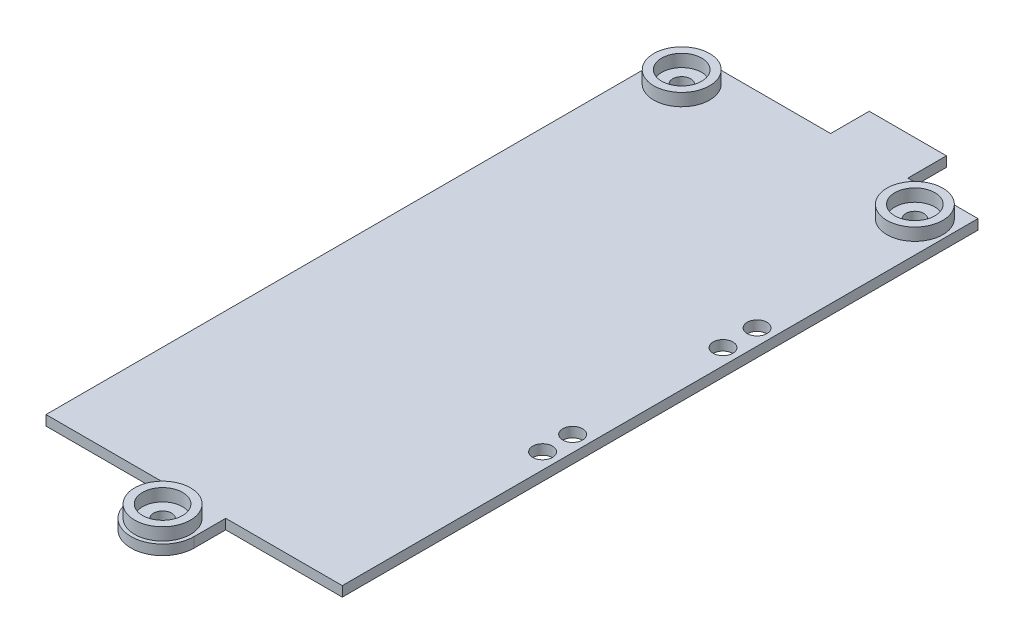
ISO-10303-21;
HEADER;
FILE_DESCRIPTION(('STEP AP214'),'2;1');
FILE_NAME('part.step','',(''),(''),'','','');
FILE_SCHEMA(('AUTOMOTIVE_DESIGN { 1 0 10303 214 1 1 1 1 }'));
ENDSEC;
DATA;
#1=APPLICATION_CONTEXT('core data for automotive mechanical design processes');
#2=APPLICATION_PROTOCOL_DEFINITION('international standard','automotive_design',2000,#1);
#3=PRODUCT_CONTEXT('',#1,'mechanical');
#4=PRODUCT('Part','Part','',(#3));
#5=PRODUCT_RELATED_PRODUCT_CATEGORY('part','',(#4));
#6=PRODUCT_DEFINITION_FORMATION('','',#4);
#7=PRODUCT_DEFINITION_CONTEXT('part definition',#1,'design');
#8=PRODUCT_DEFINITION('design','',#6,#7);
#9=PRODUCT_DEFINITION_SHAPE('','',#8);
#10=(LENGTH_UNIT() NAMED_UNIT(*) SI_UNIT(.MILLI.,.METRE.));
#11=(NAMED_UNIT(*) PLANE_ANGLE_UNIT() SI_UNIT($,.RADIAN.));
#12=(NAMED_UNIT(*) SI_UNIT($,.STERADIAN.) SOLID_ANGLE_UNIT());
#13=UNCERTAINTY_MEASURE_WITH_UNIT(LENGTH_MEASURE(1.E-05),#10,'distance_accuracy_value','');
#14=(GEOMETRIC_REPRESENTATION_CONTEXT(3) GLOBAL_UNCERTAINTY_ASSIGNED_CONTEXT((#13)) GLOBAL_UNIT_ASSIGNED_CONTEXT((#10,
#11,#12)) REPRESENTATION_CONTEXT('',''));
#15=CARTESIAN_POINT('',(0.,0.,0.));
#16=DIRECTION('',(0.,0.,1.));
#17=DIRECTION('',(1.,0.,0.));
#18=AXIS2_PLACEMENT_3D('',#15,#16,#17);
#19=CARTESIAN_POINT('',(0.,4.35801498127341,0.));
#20=DIRECTION('',(0.,1.,0.));
#21=DIRECTION('',(0.,0.,1.));
#22=AXIS2_PLACEMENT_3D('',#19,#20,#21);
#23=PLANE('',#22);
#24=CARTESIAN_POINT('',(2.05464419475655,4.35801498127341,2.23));
#25=DIRECTION('',(0.,1.,0.));
#26=DIRECTION('',(0.,0.,1.));
#27=AXIS2_PLACEMENT_3D('',#24,#25,#26);
#28=CIRCLE('',#27,1.143);
#29=CARTESIAN_POINT('',(2.05464419475655,4.35801498127341,3.373));
#30=VERTEX_POINT('',#29);
#31=EDGE_CURVE('E320',#30,#30,#28,.T.);
#32=ORIENTED_EDGE('',*,*,#31,.F.);
#33=EDGE_LOOP('',(#32));
#34=FACE_BOUND('',#33,.T.);
#35=CARTESIAN_POINT('',(2.05464419475655,4.35801498127341,2.23));
#36=DIRECTION('',(0.,1.,0.));
#37=DIRECTION('',(0.,0.,1.));
#38=AXIS2_PLACEMENT_3D('',#35,#36,#37);
#39=CIRCLE('',#38,2.54);
#40=CARTESIAN_POINT('',(2.05464419475655,4.35801498127341,4.77));
#41=VERTEX_POINT('',#40);
#42=EDGE_CURVE('E11',#41,#41,#39,.F.);
#43=ORIENTED_EDGE('',*,*,#42,.F.);
#44=EDGE_LOOP('',(#43));
#45=FACE_BOUND('',#44,.T.);
#46=ADVANCED_FACE('F37',(#34,#45),#23,.T.);
#47=CARTESIAN_POINT('',(-27.4853558052435,4.35801498127341,2.23));
#48=DIRECTION('',(0.,1.,0.));
#49=DIRECTION('',(0.,0.,1.));
#50=AXIS2_PLACEMENT_3D('',#47,#48,#49);
#51=CIRCLE('',#50,1.143);
#52=CARTESIAN_POINT('',(-27.4853558052435,4.35801498127341,3.373));
#53=VERTEX_POINT('',#52);
#54=EDGE_CURVE('E316',#53,#53,#51,.T.);
#55=ORIENTED_EDGE('',*,*,#54,.F.);
#56=EDGE_LOOP('',(#55));
#57=FACE_BOUND('',#56,.T.);
#58=CARTESIAN_POINT('',(-27.4853558052435,4.35801498127341,2.23));
#59=DIRECTION('',(0.,1.,0.));
#60=DIRECTION('',(0.,0.,1.));
#61=AXIS2_PLACEMENT_3D('',#58,#59,#60);
#62=CIRCLE('',#61,2.54);
#63=CARTESIAN_POINT('',(-27.4853558052435,4.35801498127341,4.77));
#64=VERTEX_POINT('',#63);
#65=EDGE_CURVE('E45',#64,#64,#62,.F.);
#66=ORIENTED_EDGE('',*,*,#65,.F.);
#67=EDGE_LOOP('',(#66));
#68=FACE_BOUND('',#67,.T.);
#69=ADVANCED_FACE('F184',(#57,#68),#23,.T.);
#70=CARTESIAN_POINT('',(-12.7153558052435,4.35801498127341,82.77));
#71=DIRECTION('',(0.,1.,0.));
#72=DIRECTION('',(0.,0.,1.));
#73=AXIS2_PLACEMENT_3D('',#70,#71,#72);
#74=CIRCLE('',#73,1.143);
#75=CARTESIAN_POINT('',(-12.7153558052435,4.35801498127341,83.913));
#76=VERTEX_POINT('',#75);
#77=EDGE_CURVE('E317',#76,#76,#74,.T.);
#78=ORIENTED_EDGE('',*,*,#77,.F.);
#79=EDGE_LOOP('',(#78));
#80=FACE_BOUND('',#79,.T.);
#81=CARTESIAN_POINT('',(-12.7153558052435,4.35801498127341,82.77));
#82=DIRECTION('',(0.,1.,0.));
#83=DIRECTION('',(0.,0.,1.));
#84=AXIS2_PLACEMENT_3D('',#81,#82,#83);
#85=CIRCLE('',#84,2.54);
#86=CARTESIAN_POINT('',(-12.7153558052435,4.35801498127341,85.31));
#87=VERTEX_POINT('',#86);
#88=EDGE_CURVE('E177',#87,#87,#85,.F.);
#89=ORIENTED_EDGE('',*,*,#88,.F.);
#90=EDGE_LOOP('',(#89));
#91=FACE_BOUND('',#90,.T.);
#92=ADVANCED_FACE('F186',(#80,#91),#23,.T.);
#93=CARTESIAN_POINT('',(0.,0.,-1.77));
#94=DIRECTION('',(0.,0.,-1.));
#95=DIRECTION('',(-1.,0.,0.));
#96=AXIS2_PLACEMENT_3D('',#93,#94,#95);
#97=PLANE('',#96);
#98=DIRECTION('',(1.,0.,0.));
#99=VECTOR('',#98,1.);
#100=CARTESIAN_POINT('',(0.,3.08801498127341,-1.77));
#101=LINE('',#100,#99);
#102=CARTESIAN_POINT('',(-31.4853558052435,3.08801498127341,-1.76999999999999));
#103=VERTEX_POINT('',#102);
#104=CARTESIAN_POINT('',(-12.6153558052435,3.08801498127341,-1.77));
#105=VERTEX_POINT('',#104);
#106=EDGE_CURVE('E139',#103,#105,#101,.T.);
#107=ORIENTED_EDGE('',*,*,#106,.F.);
#108=DIRECTION('',(0.,1.,0.));
#109=VECTOR('',#108,1.);
#110=CARTESIAN_POINT('',(-31.4853558052435,3.08801498127341,-1.77));
#111=LINE('',#110,#109);
#112=CARTESIAN_POINT('',(-31.4853558052435,4.35801498127341,-1.77));
#113=VERTEX_POINT('',#112);
#114=EDGE_CURVE('E167',#103,#113,#111,.T.);
#115=ORIENTED_EDGE('',*,*,#114,.T.);
#116=DIRECTION('',(1.,0.,0.));
#117=VECTOR('',#116,1.);
#118=CARTESIAN_POINT('',(0.,4.35801498127341,-1.77));
#119=LINE('',#118,#117);
#120=CARTESIAN_POINT('',(-12.6153558052435,4.35801498127341,-1.77));
#121=VERTEX_POINT('',#120);
#122=EDGE_CURVE('E278',#113,#121,#119,.T.);
#123=ORIENTED_EDGE('',*,*,#122,.T.);
#124=DIRECTION('',(0.,1.,0.));
#125=VECTOR('',#124,1.);
#126=CARTESIAN_POINT('',(-12.6153558052435,0.,-1.77));
#127=LINE('',#126,#125);
#128=EDGE_CURVE('E175',#105,#121,#127,.T.);
#129=ORIENTED_EDGE('',*,*,#128,.F.);
#130=EDGE_LOOP('',(#107,#115,#123,#129));
#131=FACE_BOUND('',#130,.T.);
#132=ADVANCED_FACE('F193',(#131),#97,.T.);
#133=CARTESIAN_POINT('',(0.,0.,78.77));
#134=DIRECTION('',(0.,0.,1.));
#135=DIRECTION('',(1.,0.,0.));
#136=AXIS2_PLACEMENT_3D('',#133,#134,#135);
#137=PLANE('',#136);
#138=DIRECTION('',(-1.,0.,0.));
#139=VECTOR('',#138,1.);
#140=CARTESIAN_POINT('',(0.,3.08801498127341,78.77));
#141=LINE('',#140,#139);
#142=CARTESIAN_POINT('',(6.05464419475655,3.08801498127341,78.77));
#143=VERTEX_POINT('',#142);
#144=CARTESIAN_POINT('',(-8.71535580524345,3.08801498127341,78.77));
#145=VERTEX_POINT('',#144);
#146=EDGE_CURVE('E251',#143,#145,#141,.T.);
#147=ORIENTED_EDGE('',*,*,#146,.F.);
#148=DIRECTION('',(0.,1.,0.));
#149=VECTOR('',#148,1.);
#150=CARTESIAN_POINT('',(6.05464419475655,3.08801498127341,78.77));
#151=LINE('',#150,#149);
#152=CARTESIAN_POINT('',(6.05464419475655,4.35801498127341,78.77));
#153=VERTEX_POINT('',#152);
#154=EDGE_CURVE('E172',#143,#153,#151,.T.);
#155=ORIENTED_EDGE('',*,*,#154,.T.);
#156=DIRECTION('',(1.,0.,0.));
#157=VECTOR('',#156,1.);
#158=CARTESIAN_POINT('',(0.,4.35801498127341,78.77));
#159=LINE('',#158,#157);
#160=CARTESIAN_POINT('',(-8.71535580524345,4.35801498127341,78.77));
#161=VERTEX_POINT('',#160);
#162=EDGE_CURVE('E250',#161,#153,#159,.T.);
#163=ORIENTED_EDGE('',*,*,#162,.F.);
#164=DIRECTION('',(0.,-1.,0.));
#165=VECTOR('',#164,1.);
#166=CARTESIAN_POINT('',(-8.71535580524345,14.4017234802582,78.77));
#167=LINE('',#166,#165);
#168=EDGE_CURVE('E52',#161,#145,#167,.T.);
#169=ORIENTED_EDGE('',*,*,#168,.T.);
#170=EDGE_LOOP('',(#147,#155,#163,#169));
#171=FACE_BOUND('',#170,.T.);
#172=ADVANCED_FACE('F229',(#171),#137,.T.);
#173=DIRECTION('',(1.,0.,0.));
#174=VECTOR('',#173,1.);
#175=CARTESIAN_POINT('',(0.,3.08801498127341,-1.77));
#176=LINE('',#175,#174);
#177=CARTESIAN_POINT('',(-2.83535580524345,3.08801498127341,-1.77));
#178=VERTEX_POINT('',#177);
#179=CARTESIAN_POINT('',(6.05464419475655,3.08801498127341,-1.77));
#180=VERTEX_POINT('',#179);
#181=EDGE_CURVE('E149',#178,#180,#176,.T.);
#182=ORIENTED_EDGE('',*,*,#181,.F.);
#183=DIRECTION('',(0.,-1.,0.));
#184=VECTOR('',#183,1.);
#185=CARTESIAN_POINT('',(-2.83535580524345,0.,-1.77));
#186=LINE('',#185,#184);
#187=CARTESIAN_POINT('',(-2.83535580524345,4.35801498127341,-1.77));
#188=VERTEX_POINT('',#187);
#189=EDGE_CURVE('E148',#188,#178,#186,.T.);
#190=ORIENTED_EDGE('',*,*,#189,.F.);
#191=DIRECTION('',(-1.,0.,0.));
#192=VECTOR('',#191,1.);
#193=CARTESIAN_POINT('',(0.,4.35801498127341,-1.77));
#194=LINE('',#193,#192);
#195=CARTESIAN_POINT('',(6.05464419475655,4.35801498127341,-1.77));
#196=VERTEX_POINT('',#195);
#197=EDGE_CURVE('E269',#196,#188,#194,.T.);
#198=ORIENTED_EDGE('',*,*,#197,.F.);
#199=DIRECTION('',(0.,-1.,0.));
#200=VECTOR('',#199,1.);
#201=CARTESIAN_POINT('',(6.05464419475655,3.08801498127341,-1.77));
#202=LINE('',#201,#200);
#203=EDGE_CURVE('E159',#196,#180,#202,.T.);
#204=ORIENTED_EDGE('',*,*,#203,.T.);
#205=EDGE_LOOP('',(#182,#190,#198,#204));
#206=FACE_BOUND('',#205,.T.);
#207=ADVANCED_FACE('F226',(#206),#97,.T.);
#208=CARTESIAN_POINT('',(-31.4853558052435,3.08801498127341,77.));
#209=DIRECTION('',(1.,0.,0.));
#210=DIRECTION('',(0.,0.,-1.));
#211=AXIS2_PLACEMENT_3D('',#208,#209,#210);
#212=PLANE('',#211);
#213=ORIENTED_EDGE('',*,*,#114,.F.);
#214=DIRECTION('',(0.,0.,1.));
#215=VECTOR('',#214,1.);
#216=CARTESIAN_POINT('',(-31.4853558052435,3.08801498127341,77.));
#217=LINE('',#216,#215);
#218=CARTESIAN_POINT('',(-31.4853558052435,3.08801498127341,78.77));
#219=VERTEX_POINT('',#218);
#220=EDGE_CURVE('E140',#103,#219,#217,.T.);
#221=ORIENTED_EDGE('',*,*,#220,.T.);
#222=DIRECTION('',(0.,-1.,0.));
#223=VECTOR('',#222,1.);
#224=CARTESIAN_POINT('',(-31.4853558052435,3.08801498127341,78.77));
#225=LINE('',#224,#223);
#226=CARTESIAN_POINT('',(-31.4853558052435,4.35801498127341,78.77));
#227=VERTEX_POINT('',#226);
#228=EDGE_CURVE('E169',#227,#219,#225,.T.);
#229=ORIENTED_EDGE('',*,*,#228,.F.);
#230=DIRECTION('',(0.,0.,-1.));
#231=VECTOR('',#230,1.);
#232=CARTESIAN_POINT('',(-31.4853558052435,4.35801498127341,0.));
#233=LINE('',#232,#231);
#234=EDGE_CURVE('E281',#227,#113,#233,.T.);
#235=ORIENTED_EDGE('',*,*,#234,.T.);
#236=EDGE_LOOP('',(#213,#221,#229,#235));
#237=FACE_BOUND('',#236,.T.);
#238=ADVANCED_FACE('F39',(#237),#212,.F.);
#239=CARTESIAN_POINT('',(6.05464419475655,-14.1819850187266,77.));
#240=DIRECTION('',(-1.,0.,0.));
#241=DIRECTION('',(0.,0.,1.));
#242=AXIS2_PLACEMENT_3D('',#239,#240,#241);
#243=PLANE('',#242);
#244=ORIENTED_EDGE('',*,*,#154,.F.);
#245=DIRECTION('',(0.,0.,-1.));
#246=VECTOR('',#245,1.);
#247=CARTESIAN_POINT('',(6.05464419475655,3.08801498127341,77.));
#248=LINE('',#247,#246);
#249=EDGE_CURVE('E243',#143,#180,#248,.T.);
#250=ORIENTED_EDGE('',*,*,#249,.T.);
#251=ORIENTED_EDGE('',*,*,#203,.F.);
#252=DIRECTION('',(0.,0.,-1.));
#253=VECTOR('',#252,1.);
#254=CARTESIAN_POINT('',(6.05464419475655,4.35801498127341,0.));
#255=LINE('',#254,#253);
#256=EDGE_CURVE('E245',#153,#196,#255,.T.);
#257=ORIENTED_EDGE('',*,*,#256,.F.);
#258=EDGE_LOOP('',(#244,#250,#251,#257));
#259=FACE_BOUND('',#258,.T.);
#260=ADVANCED_FACE('F232',(#259),#243,.F.);
#261=DIRECTION('',(1.,0.,0.));
#262=VECTOR('',#261,1.);
#263=CARTESIAN_POINT('',(0.,3.08801498127341,78.77));
#264=LINE('',#263,#262);
#265=CARTESIAN_POINT('',(-16.7153558052435,3.08801498127341,78.77));
#266=VERTEX_POINT('',#265);
#267=EDGE_CURVE('E267',#219,#266,#264,.T.);
#268=ORIENTED_EDGE('',*,*,#267,.T.);
#269=DIRECTION('',(0.,-1.,0.));
#270=VECTOR('',#269,1.);
#271=CARTESIAN_POINT('',(-16.7153558052435,14.4017234802582,78.77));
#272=LINE('',#271,#270);
#273=CARTESIAN_POINT('',(-16.7153558052435,4.35801498127341,78.77));
#274=VERTEX_POINT('',#273);
#275=EDGE_CURVE('E157',#274,#266,#272,.T.);
#276=ORIENTED_EDGE('',*,*,#275,.F.);
#277=DIRECTION('',(1.,0.,0.));
#278=VECTOR('',#277,1.);
#279=CARTESIAN_POINT('',(0.,4.35801498127341,78.77));
#280=LINE('',#279,#278);
#281=EDGE_CURVE('E284',#227,#274,#280,.T.);
#282=ORIENTED_EDGE('',*,*,#281,.F.);
#283=ORIENTED_EDGE('',*,*,#228,.T.);
#284=EDGE_LOOP('',(#268,#276,#282,#283));
#285=FACE_BOUND('',#284,.T.);
#286=ADVANCED_FACE('F220',(#285),#137,.T.);
#287=CARTESIAN_POINT('',(-12.6153558052435,-4.15198501872659,-6.66));
#288=DIRECTION('',(0.,0.,-1.));
#289=DIRECTION('',(-1.,0.,0.));
#290=AXIS2_PLACEMENT_3D('',#287,#288,#289);
#291=PLANE('',#290);
#292=DIRECTION('',(-1.,0.,0.));
#293=VECTOR('',#292,1.);
#294=CARTESIAN_POINT('',(0.,3.08801498127341,-6.66));
#295=LINE('',#294,#293);
#296=CARTESIAN_POINT('',(-2.83535580524345,3.08801498127341,-6.66));
#297=VERTEX_POINT('',#296);
#298=CARTESIAN_POINT('',(-12.6153558052435,3.08801498127341,-6.66));
#299=VERTEX_POINT('',#298);
#300=EDGE_CURVE('E129',#297,#299,#295,.T.);
#301=ORIENTED_EDGE('',*,*,#300,.T.);
#302=DIRECTION('',(0.,1.,0.));
#303=VECTOR('',#302,1.);
#304=CARTESIAN_POINT('',(-12.6153558052435,-4.15198501872659,-6.66));
#305=LINE('',#304,#303);
#306=CARTESIAN_POINT('',(-12.6153558052435,4.35801498127341,-6.66));
#307=VERTEX_POINT('',#306);
#308=EDGE_CURVE('E156',#299,#307,#305,.T.);
#309=ORIENTED_EDGE('',*,*,#308,.T.);
#310=DIRECTION('',(-1.,0.,0.));
#311=VECTOR('',#310,1.);
#312=CARTESIAN_POINT('',(0.,4.35801498127341,-6.66));
#313=LINE('',#312,#311);
#314=CARTESIAN_POINT('',(-2.83535580524345,4.35801498127341,-6.66));
#315=VERTEX_POINT('',#314);
#316=EDGE_CURVE('E155',#315,#307,#313,.T.);
#317=ORIENTED_EDGE('',*,*,#316,.F.);
#318=DIRECTION('',(0.,1.,0.));
#319=VECTOR('',#318,1.);
#320=CARTESIAN_POINT('',(-2.83535580524345,-4.15198501872659,-6.66));
#321=LINE('',#320,#319);
#322=EDGE_CURVE('E146',#297,#315,#321,.T.);
#323=ORIENTED_EDGE('',*,*,#322,.F.);
#324=EDGE_LOOP('',(#301,#309,#317,#323));
#325=FACE_BOUND('',#324,.T.);
#326=ADVANCED_FACE('F153',(#325),#291,.T.);
#327=CARTESIAN_POINT('',(-2.83535580524345,-4.15198501872659,-6.66));
#328=DIRECTION('',(1.,0.,0.));
#329=DIRECTION('',(0.,0.,-1.));
#330=AXIS2_PLACEMENT_3D('',#327,#328,#329);
#331=PLANE('',#330);
#332=DIRECTION('',(0.,0.,1.));
#333=VECTOR('',#332,1.);
#334=CARTESIAN_POINT('',(-2.83535580524345,3.08801498127341,-6.66));
#335=LINE('',#334,#333);
#336=EDGE_CURVE('E132',#297,#178,#335,.T.);
#337=ORIENTED_EDGE('',*,*,#336,.F.);
#338=ORIENTED_EDGE('',*,*,#322,.T.);
#339=DIRECTION('',(0.,0.,-1.));
#340=VECTOR('',#339,1.);
#341=CARTESIAN_POINT('',(-2.83535580524345,4.35801498127341,0.));
#342=LINE('',#341,#340);
#343=EDGE_CURVE('E272',#188,#315,#342,.T.);
#344=ORIENTED_EDGE('',*,*,#343,.F.);
#345=ORIENTED_EDGE('',*,*,#189,.T.);
#346=EDGE_LOOP('',(#337,#338,#344,#345));
#347=FACE_BOUND('',#346,.T.);
#348=ADVANCED_FACE('F144',(#347),#331,.T.);
#349=CARTESIAN_POINT('',(-12.6153558052435,-4.15198501872659,-6.66));
#350=DIRECTION('',(-1.,0.,0.));
#351=DIRECTION('',(0.,0.,1.));
#352=AXIS2_PLACEMENT_3D('',#349,#350,#351);
#353=PLANE('',#352);
#354=DIRECTION('',(0.,0.,-1.));
#355=VECTOR('',#354,1.);
#356=CARTESIAN_POINT('',(-12.6153558052435,3.08801498127341,-6.66));
#357=LINE('',#356,#355);
#358=EDGE_CURVE('E135',#105,#299,#357,.T.);
#359=ORIENTED_EDGE('',*,*,#358,.F.);
#360=ORIENTED_EDGE('',*,*,#128,.T.);
#361=DIRECTION('',(0.,0.,-1.));
#362=VECTOR('',#361,1.);
#363=CARTESIAN_POINT('',(-12.6153558052435,4.35801498127341,0.));
#364=LINE('',#363,#362);
#365=EDGE_CURVE('E275',#121,#307,#364,.T.);
#366=ORIENTED_EDGE('',*,*,#365,.T.);
#367=ORIENTED_EDGE('',*,*,#308,.F.);
#368=EDGE_LOOP('',(#359,#360,#366,#367));
#369=FACE_BOUND('',#368,.T.);
#370=ADVANCED_FACE('F217',(#369),#353,.T.);
#371=CARTESIAN_POINT('',(-12.7153558052435,14.4017234802582,82.77));
#372=DIRECTION('',(0.,-1.,0.));
#373=DIRECTION('',(0.,0.,-1.));
#374=AXIS2_PLACEMENT_3D('',#371,#372,#373);
#375=CYLINDRICAL_SURFACE('',#374,4.);
#376=DIRECTION('',(0.,-1.,0.));
#377=VECTOR('',#376,1.);
#378=CARTESIAN_POINT('',(-16.7153558052435,14.4017234802582,82.77));
#379=LINE('',#378,#377);
#380=CARTESIAN_POINT('',(-16.7153558052435,4.35801498127341,82.77));
#381=VERTEX_POINT('',#380);
#382=CARTESIAN_POINT('',(-16.7153558052435,3.08801498127341,82.77));
#383=VERTEX_POINT('',#382);
#384=EDGE_CURVE('E293',#381,#383,#379,.T.);
#385=ORIENTED_EDGE('',*,*,#384,.T.);
#386=CARTESIAN_POINT('',(-12.7153558052435,3.08801498127341,82.77));
#387=DIRECTION('',(0.,1.,0.));
#388=DIRECTION('',(0.,0.,1.));
#389=AXIS2_PLACEMENT_3D('',#386,#387,#388);
#390=CIRCLE('',#389,4.);
#391=CARTESIAN_POINT('',(-8.71535580524345,3.08801498127341,82.77));
#392=VERTEX_POINT('',#391);
#393=EDGE_CURVE('E254',#383,#392,#390,.T.);
#394=ORIENTED_EDGE('',*,*,#393,.T.);
#395=DIRECTION('',(0.,-1.,0.));
#396=VECTOR('',#395,1.);
#397=CARTESIAN_POINT('',(-8.71535580524345,14.4017234802582,82.77));
#398=LINE('',#397,#396);
#399=CARTESIAN_POINT('',(-8.71535580524345,4.35801498127341,82.77));
#400=VERTEX_POINT('',#399);
#401=EDGE_CURVE('E60',#400,#392,#398,.T.);
#402=ORIENTED_EDGE('',*,*,#401,.F.);
#403=CARTESIAN_POINT('',(-12.7153558052435,4.35801498127341,82.77));
#404=DIRECTION('',(0.,1.,0.));
#405=DIRECTION('',(0.,0.,1.));
#406=AXIS2_PLACEMENT_3D('',#403,#404,#405);
#407=CIRCLE('',#406,4.);
#408=EDGE_CURVE('E290',#381,#400,#407,.T.);
#409=ORIENTED_EDGE('',*,*,#408,.F.);
#410=EDGE_LOOP('',(#385,#394,#402,#409));
#411=FACE_BOUND('',#410,.T.);
#412=ADVANCED_FACE('F214',(#411),#375,.T.);
#413=CARTESIAN_POINT('',(-8.71535580524345,14.4017234802582,0.));
#414=DIRECTION('',(1.,0.,0.));
#415=DIRECTION('',(0.,0.,-1.));
#416=AXIS2_PLACEMENT_3D('',#413,#414,#415);
#417=PLANE('',#416);
#418=DIRECTION('',(0.,0.,1.));
#419=VECTOR('',#418,1.);
#420=CARTESIAN_POINT('',(-8.71535580524345,3.08801498127341,0.));
#421=LINE('',#420,#419);
#422=EDGE_CURVE('E252',#145,#392,#421,.T.);
#423=ORIENTED_EDGE('',*,*,#422,.F.);
#424=ORIENTED_EDGE('',*,*,#168,.F.);
#425=DIRECTION('',(0.,0.,-1.));
#426=VECTOR('',#425,1.);
#427=CARTESIAN_POINT('',(-8.71535580524345,4.35801498127341,0.));
#428=LINE('',#427,#426);
#429=EDGE_CURVE('E292',#400,#161,#428,.T.);
#430=ORIENTED_EDGE('',*,*,#429,.F.);
#431=ORIENTED_EDGE('',*,*,#401,.T.);
#432=EDGE_LOOP('',(#423,#424,#430,#431));
#433=FACE_BOUND('',#432,.T.);
#434=ADVANCED_FACE('F210',(#433),#417,.T.);
#435=CARTESIAN_POINT('',(-16.7153558052435,14.4017234802582,0.));
#436=DIRECTION('',(-1.,0.,0.));
#437=DIRECTION('',(0.,0.,1.));
#438=AXIS2_PLACEMENT_3D('',#435,#436,#437);
#439=PLANE('',#438);
#440=DIRECTION('',(0.,0.,-1.));
#441=VECTOR('',#440,1.);
#442=CARTESIAN_POINT('',(-16.7153558052435,3.08801498127341,0.));
#443=LINE('',#442,#441);
#444=EDGE_CURVE('E260',#383,#266,#443,.T.);
#445=ORIENTED_EDGE('',*,*,#444,.F.);
#446=ORIENTED_EDGE('',*,*,#384,.F.);
#447=DIRECTION('',(0.,0.,1.));
#448=VECTOR('',#447,1.);
#449=CARTESIAN_POINT('',(-16.7153558052435,4.35801498127341,0.));
#450=LINE('',#449,#448);
#451=EDGE_CURVE('E287',#274,#381,#450,.T.);
#452=ORIENTED_EDGE('',*,*,#451,.F.);
#453=ORIENTED_EDGE('',*,*,#275,.T.);
#454=EDGE_LOOP('',(#445,#446,#452,#453));
#455=FACE_BOUND('',#454,.T.);
#456=ADVANCED_FACE('F206',(#455),#439,.T.);
#457=CARTESIAN_POINT('',(0.,3.08801498127341,0.));
#458=DIRECTION('',(0.,1.,0.));
#459=DIRECTION('',(0.,0.,1.));
#460=AXIS2_PLACEMENT_3D('',#457,#458,#459);
#461=PLANE('',#460);
#462=CARTESIAN_POINT('',(4.05464419475656,3.08801498127341,51.3968));
#463=DIRECTION('',(0.,1.,0.));
#464=DIRECTION('',(0.,0.,1.));
#465=AXIS2_PLACEMENT_3D('',#462,#463,#464);
#466=CIRCLE('',#465,1.25);
#467=CARTESIAN_POINT('',(4.05464419475656,3.08801498127341,52.6468));
#468=VERTEX_POINT('',#467);
#469=EDGE_CURVE('E352',#468,#468,#466,.T.);
#470=ORIENTED_EDGE('',*,*,#469,.T.);
#471=EDGE_LOOP('',(#470));
#472=FACE_BOUND('',#471,.T.);
#473=CARTESIAN_POINT('',(4.05464419475656,3.08801498127341,47.5868));
#474=DIRECTION('',(0.,1.,0.));
#475=DIRECTION('',(0.,0.,1.));
#476=AXIS2_PLACEMENT_3D('',#473,#474,#475);
#477=CIRCLE('',#476,1.25);
#478=CARTESIAN_POINT('',(4.05464419475656,3.08801498127341,48.8368));
#479=VERTEX_POINT('',#478);
#480=EDGE_CURVE('E355',#479,#479,#477,.T.);
#481=ORIENTED_EDGE('',*,*,#480,.T.);
#482=EDGE_LOOP('',(#481));
#483=FACE_BOUND('',#482,.T.);
#484=CARTESIAN_POINT('',(4.05464419475655,3.08801498127341,28.5368));
#485=DIRECTION('',(0.,1.,0.));
#486=DIRECTION('',(0.,0.,1.));
#487=AXIS2_PLACEMENT_3D('',#484,#485,#486);
#488=CIRCLE('',#487,1.25);
#489=CARTESIAN_POINT('',(4.05464419475655,3.08801498127341,29.7868));
#490=VERTEX_POINT('',#489);
#491=EDGE_CURVE('E358',#490,#490,#488,.T.);
#492=ORIENTED_EDGE('',*,*,#491,.T.);
#493=EDGE_LOOP('',(#492));
#494=FACE_BOUND('',#493,.T.);
#495=CARTESIAN_POINT('',(4.05464419475655,3.08801498127341,24.2188));
#496=DIRECTION('',(0.,1.,0.));
#497=DIRECTION('',(0.,0.,1.));
#498=AXIS2_PLACEMENT_3D('',#495,#496,#497);
#499=CIRCLE('',#498,1.25);
#500=CARTESIAN_POINT('',(4.05464419475655,3.08801498127341,25.4688));
#501=VERTEX_POINT('',#500);
#502=EDGE_CURVE('E361',#501,#501,#499,.T.);
#503=ORIENTED_EDGE('',*,*,#502,.T.);
#504=EDGE_LOOP('',(#503));
#505=FACE_BOUND('',#504,.T.);
#506=CARTESIAN_POINT('',(-27.4853558052435,3.08801498127341,2.23));
#507=DIRECTION('',(0.,1.,0.));
#508=DIRECTION('',(0.,0.,1.));
#509=AXIS2_PLACEMENT_3D('',#506,#507,#508);
#510=CIRCLE('',#509,1.143);
#511=CARTESIAN_POINT('',(-27.4853558052435,3.08801498127341,3.373));
#512=VERTEX_POINT('',#511);
#513=EDGE_CURVE('E150',#512,#512,#510,.T.);
#514=ORIENTED_EDGE('',*,*,#513,.T.);
#515=EDGE_LOOP('',(#514));
#516=FACE_BOUND('',#515,.T.);
#517=CARTESIAN_POINT('',(2.05464419475655,3.08801498127341,2.23));
#518=DIRECTION('',(0.,1.,0.));
#519=DIRECTION('',(0.,0.,1.));
#520=AXIS2_PLACEMENT_3D('',#517,#518,#519);
#521=CIRCLE('',#520,1.143);
#522=CARTESIAN_POINT('',(2.05464419475655,3.08801498127341,3.373));
#523=VERTEX_POINT('',#522);
#524=EDGE_CURVE('E310',#523,#523,#521,.T.);
#525=ORIENTED_EDGE('',*,*,#524,.T.);
#526=EDGE_LOOP('',(#525));
#527=FACE_BOUND('',#526,.T.);
#528=CARTESIAN_POINT('',(-12.7153558052435,3.08801498127341,82.77));
#529=DIRECTION('',(0.,1.,0.));
#530=DIRECTION('',(0.,0.,1.));
#531=AXIS2_PLACEMENT_3D('',#528,#529,#530);
#532=CIRCLE('',#531,1.143);
#533=CARTESIAN_POINT('',(-12.7153558052435,3.08801498127341,83.913));
#534=VERTEX_POINT('',#533);
#535=EDGE_CURVE('E313',#534,#534,#532,.T.);
#536=ORIENTED_EDGE('',*,*,#535,.T.);
#537=EDGE_LOOP('',(#536));
#538=FACE_BOUND('',#537,.T.);
#539=ORIENTED_EDGE('',*,*,#106,.T.);
#540=ORIENTED_EDGE('',*,*,#358,.T.);
#541=ORIENTED_EDGE('',*,*,#300,.F.);
#542=ORIENTED_EDGE('',*,*,#336,.T.);
#543=ORIENTED_EDGE('',*,*,#181,.T.);
#544=ORIENTED_EDGE('',*,*,#249,.F.);
#545=ORIENTED_EDGE('',*,*,#146,.T.);
#546=ORIENTED_EDGE('',*,*,#422,.T.);
#547=ORIENTED_EDGE('',*,*,#393,.F.);
#548=ORIENTED_EDGE('',*,*,#444,.T.);
#549=ORIENTED_EDGE('',*,*,#267,.F.);
#550=ORIENTED_EDGE('',*,*,#220,.F.);
#551=EDGE_LOOP('',(#539,#540,#541,#542,#543,#544,#545,#546,#547,#548,#549,#550));
#552=FACE_BOUND('',#551,.T.);
#553=ADVANCED_FACE('F131',(#472,#483,#494,#505,#516,#527,#538,#552),#461,.F.);
#554=CARTESIAN_POINT('',(4.05464419475656,4.35801498127341,51.3968));
#555=DIRECTION('',(0.,1.,0.));
#556=DIRECTION('',(0.,0.,1.));
#557=AXIS2_PLACEMENT_3D('',#554,#555,#556);
#558=CIRCLE('',#557,1.25);
#559=CARTESIAN_POINT('',(4.05464419475656,4.35801498127341,52.6468));
#560=VERTEX_POINT('',#559);
#561=EDGE_CURVE('E364',#560,#560,#558,.T.);
#562=ORIENTED_EDGE('',*,*,#561,.F.);
#563=EDGE_LOOP('',(#562));
#564=FACE_BOUND('',#563,.T.);
#565=CARTESIAN_POINT('',(4.05464419475656,4.35801498127341,47.5868));
#566=DIRECTION('',(0.,1.,0.));
#567=DIRECTION('',(0.,0.,1.));
#568=AXIS2_PLACEMENT_3D('',#565,#566,#567);
#569=CIRCLE('',#568,1.25);
#570=CARTESIAN_POINT('',(4.05464419475656,4.35801498127341,48.8368));
#571=VERTEX_POINT('',#570);
#572=EDGE_CURVE('E371',#571,#571,#569,.T.);
#573=ORIENTED_EDGE('',*,*,#572,.F.);
#574=EDGE_LOOP('',(#573));
#575=FACE_BOUND('',#574,.T.);
#576=CARTESIAN_POINT('',(4.05464419475655,4.35801498127341,28.5368));
#577=DIRECTION('',(0.,1.,0.));
#578=DIRECTION('',(0.,0.,1.));
#579=AXIS2_PLACEMENT_3D('',#576,#577,#578);
#580=CIRCLE('',#579,1.25);
#581=CARTESIAN_POINT('',(4.05464419475655,4.35801498127341,29.7868));
#582=VERTEX_POINT('',#581);
#583=EDGE_CURVE('E368',#582,#582,#580,.T.);
#584=ORIENTED_EDGE('',*,*,#583,.F.);
#585=EDGE_LOOP('',(#584));
#586=FACE_BOUND('',#585,.T.);
#587=CARTESIAN_POINT('',(4.05464419475655,4.35801498127341,24.2188));
#588=DIRECTION('',(0.,1.,0.));
#589=DIRECTION('',(0.,0.,1.));
#590=AXIS2_PLACEMENT_3D('',#587,#588,#589);
#591=CIRCLE('',#590,1.25);
#592=CARTESIAN_POINT('',(4.05464419475655,4.35801498127341,25.4688));
#593=VERTEX_POINT('',#592);
#594=EDGE_CURVE('E365',#593,#593,#591,.T.);
#595=ORIENTED_EDGE('',*,*,#594,.F.);
#596=EDGE_LOOP('',(#595));
#597=FACE_BOUND('',#596,.T.);
#598=CARTESIAN_POINT('',(2.05464419475655,4.35801498127341,2.23));
#599=DIRECTION('',(0.,1.,0.));
#600=DIRECTION('',(0.,0.,1.));
#601=AXIS2_PLACEMENT_3D('',#598,#599,#600);
#602=CIRCLE('',#601,3.54);
#603=CARTESIAN_POINT('',(2.05464419475655,4.35801498127341,5.77));
#604=VERTEX_POINT('',#603);
#605=EDGE_CURVE('E344',#604,#604,#602,.T.);
#606=ORIENTED_EDGE('',*,*,#605,.F.);
#607=EDGE_LOOP('',(#606));
#608=FACE_BOUND('',#607,.T.);
#609=CARTESIAN_POINT('',(-27.4853558052435,4.35801498127341,2.23));
#610=DIRECTION('',(0.,1.,0.));
#611=DIRECTION('',(0.,0.,1.));
#612=AXIS2_PLACEMENT_3D('',#609,#610,#611);
#613=CIRCLE('',#612,3.54);
#614=CARTESIAN_POINT('',(-27.4853558052435,4.35801498127341,5.77));
#615=VERTEX_POINT('',#614);
#616=EDGE_CURVE('E335',#615,#615,#613,.T.);
#617=ORIENTED_EDGE('',*,*,#616,.F.);
#618=EDGE_LOOP('',(#617));
#619=FACE_BOUND('',#618,.T.);
#620=CARTESIAN_POINT('',(-12.7153558052435,4.35801498127341,82.77));
#621=DIRECTION('',(0.,1.,0.));
#622=DIRECTION('',(0.,0.,1.));
#623=AXIS2_PLACEMENT_3D('',#620,#621,#622);
#624=CIRCLE('',#623,3.54);
#625=CARTESIAN_POINT('',(-12.7153558052435,4.35801498127341,86.31));
#626=VERTEX_POINT('',#625);
#627=EDGE_CURVE('E326',#626,#626,#624,.T.);
#628=ORIENTED_EDGE('',*,*,#627,.F.);
#629=EDGE_LOOP('',(#628));
#630=FACE_BOUND('',#629,.T.);
#631=ORIENTED_EDGE('',*,*,#162,.T.);
#632=ORIENTED_EDGE('',*,*,#256,.T.);
#633=ORIENTED_EDGE('',*,*,#197,.T.);
#634=ORIENTED_EDGE('',*,*,#343,.T.);
#635=ORIENTED_EDGE('',*,*,#316,.T.);
#636=ORIENTED_EDGE('',*,*,#365,.F.);
#637=ORIENTED_EDGE('',*,*,#122,.F.);
#638=ORIENTED_EDGE('',*,*,#234,.F.);
#639=ORIENTED_EDGE('',*,*,#281,.T.);
#640=ORIENTED_EDGE('',*,*,#451,.T.);
#641=ORIENTED_EDGE('',*,*,#408,.T.);
#642=ORIENTED_EDGE('',*,*,#429,.T.);
#643=EDGE_LOOP('',(#631,#632,#633,#634,#635,#636,#637,#638,#639,#640,#641,#642));
#644=FACE_BOUND('',#643,.T.);
#645=ADVANCED_FACE('F195',(#564,#575,#586,#597,#608,#619,#630,#644),#23,.T.);
#646=CARTESIAN_POINT('',(-12.7153558052435,-5.64198501872659,82.77));
#647=DIRECTION('',(0.,1.,0.));
#648=DIRECTION('',(0.,0.,1.));
#649=AXIS2_PLACEMENT_3D('',#646,#647,#648);
#650=CYLINDRICAL_SURFACE('',#649,1.143);
#651=ORIENTED_EDGE('',*,*,#77,.T.);
#652=EDGE_LOOP('',(#651));
#653=FACE_BOUND('',#652,.T.);
#654=ORIENTED_EDGE('',*,*,#535,.F.);
#655=EDGE_LOOP('',(#654));
#656=FACE_BOUND('',#655,.T.);
#657=ADVANCED_FACE('F201',(#653,#656),#650,.F.);
#658=CARTESIAN_POINT('',(2.05464419475655,-5.64198501872659,2.23));
#659=DIRECTION('',(0.,1.,0.));
#660=DIRECTION('',(0.,0.,1.));
#661=AXIS2_PLACEMENT_3D('',#658,#659,#660);
#662=CYLINDRICAL_SURFACE('',#661,1.143);
#663=ORIENTED_EDGE('',*,*,#31,.T.);
#664=EDGE_LOOP('',(#663));
#665=FACE_BOUND('',#664,.T.);
#666=ORIENTED_EDGE('',*,*,#524,.F.);
#667=EDGE_LOOP('',(#666));
#668=FACE_BOUND('',#667,.T.);
#669=ADVANCED_FACE('F411',(#665,#668),#662,.F.);
#670=CARTESIAN_POINT('',(-27.4853558052435,-5.64198501872659,2.23));
#671=DIRECTION('',(0.,1.,0.));
#672=DIRECTION('',(0.,0.,1.));
#673=AXIS2_PLACEMENT_3D('',#670,#671,#672);
#674=CYLINDRICAL_SURFACE('',#673,1.143);
#675=ORIENTED_EDGE('',*,*,#54,.T.);
#676=EDGE_LOOP('',(#675));
#677=FACE_BOUND('',#676,.T.);
#678=ORIENTED_EDGE('',*,*,#513,.F.);
#679=EDGE_LOOP('',(#678));
#680=FACE_BOUND('',#679,.T.);
#681=ADVANCED_FACE('F405',(#677,#680),#674,.F.);
#682=CARTESIAN_POINT('',(-12.7153558052435,5.93281498127341,82.77));
#683=DIRECTION('',(0.,1.,0.));
#684=DIRECTION('',(0.,0.,1.));
#685=AXIS2_PLACEMENT_3D('',#682,#683,#684);
#686=PLANE('',#685);
#687=CARTESIAN_POINT('',(-12.7153558052435,5.93281498127341,82.77));
#688=DIRECTION('',(0.,1.,0.));
#689=DIRECTION('',(0.,0.,1.));
#690=AXIS2_PLACEMENT_3D('',#687,#688,#689);
#691=CIRCLE('',#690,3.54);
#692=CARTESIAN_POINT('',(-12.7153558052435,5.93281498127341,86.31));
#693=VERTEX_POINT('',#692);
#694=EDGE_CURVE('E321',#693,#693,#691,.T.);
#695=ORIENTED_EDGE('',*,*,#694,.T.);
#696=EDGE_LOOP('',(#695));
#697=FACE_BOUND('',#696,.T.);
#698=CARTESIAN_POINT('',(-12.7153558052435,5.93281498127341,82.77));
#699=DIRECTION('',(0.,1.,0.));
#700=DIRECTION('',(0.,0.,1.));
#701=AXIS2_PLACEMENT_3D('',#698,#699,#700);
#702=CIRCLE('',#701,2.54);
#703=CARTESIAN_POINT('',(-12.7153558052435,5.93281498127341,85.31));
#704=VERTEX_POINT('',#703);
#705=EDGE_CURVE('E329',#704,#704,#702,.T.);
#706=ORIENTED_EDGE('',*,*,#705,.F.);
#707=EDGE_LOOP('',(#706));
#708=FACE_BOUND('',#707,.T.);
#709=ADVANCED_FACE('F395',(#697,#708),#686,.T.);
#710=CARTESIAN_POINT('',(-12.7153558052435,5.93281498127341,82.77));
#711=DIRECTION('',(0.,-1.,0.));
#712=DIRECTION('',(0.,0.,-1.));
#713=AXIS2_PLACEMENT_3D('',#710,#711,#712);
#714=CYLINDRICAL_SURFACE('',#713,3.54);
#715=ORIENTED_EDGE('',*,*,#694,.F.);
#716=EDGE_LOOP('',(#715));
#717=FACE_BOUND('',#716,.T.);
#718=ORIENTED_EDGE('',*,*,#627,.T.);
#719=EDGE_LOOP('',(#718));
#720=FACE_BOUND('',#719,.T.);
#721=ADVANCED_FACE('F392',(#717,#720),#714,.T.);
#722=CARTESIAN_POINT('',(-12.7153558052435,5.93281498127341,82.77));
#723=DIRECTION('',(0.,-1.,0.));
#724=DIRECTION('',(0.,0.,-1.));
#725=AXIS2_PLACEMENT_3D('',#722,#723,#724);
#726=CYLINDRICAL_SURFACE('',#725,2.54);
#727=ORIENTED_EDGE('',*,*,#705,.T.);
#728=EDGE_LOOP('',(#727));
#729=FACE_BOUND('',#728,.T.);
#730=ORIENTED_EDGE('',*,*,#88,.T.);
#731=EDGE_LOOP('',(#730));
#732=FACE_BOUND('',#731,.T.);
#733=ADVANCED_FACE('F394',(#729,#732),#726,.F.);
#734=CARTESIAN_POINT('',(-27.4853558052435,5.93281498127341,2.23));
#735=DIRECTION('',(0.,1.,0.));
#736=DIRECTION('',(0.,0.,1.));
#737=AXIS2_PLACEMENT_3D('',#734,#735,#736);
#738=PLANE('',#737);
#739=CARTESIAN_POINT('',(-27.4853558052435,5.93281498127341,2.23));
#740=DIRECTION('',(0.,1.,0.));
#741=DIRECTION('',(0.,0.,1.));
#742=AXIS2_PLACEMENT_3D('',#739,#740,#741);
#743=CIRCLE('',#742,3.54);
#744=CARTESIAN_POINT('',(-27.4853558052435,5.93281498127341,5.77));
#745=VERTEX_POINT('',#744);
#746=EDGE_CURVE('E334',#745,#745,#743,.T.);
#747=ORIENTED_EDGE('',*,*,#746,.T.);
#748=EDGE_LOOP('',(#747));
#749=FACE_BOUND('',#748,.T.);
#750=CARTESIAN_POINT('',(-27.4853558052435,5.93281498127341,2.23));
#751=DIRECTION('',(0.,1.,0.));
#752=DIRECTION('',(0.,0.,1.));
#753=AXIS2_PLACEMENT_3D('',#750,#751,#752);
#754=CIRCLE('',#753,2.54);
#755=CARTESIAN_POINT('',(-27.4853558052435,5.93281498127341,4.77));
#756=VERTEX_POINT('',#755);
#757=EDGE_CURVE('E338',#756,#756,#754,.T.);
#758=ORIENTED_EDGE('',*,*,#757,.F.);
#759=EDGE_LOOP('',(#758));
#760=FACE_BOUND('',#759,.T.);
#761=ADVANCED_FACE('F402',(#749,#760),#738,.T.);
#762=CARTESIAN_POINT('',(-27.4853558052435,5.93281498127341,2.23));
#763=DIRECTION('',(0.,-1.,0.));
#764=DIRECTION('',(0.,0.,-1.));
#765=AXIS2_PLACEMENT_3D('',#762,#763,#764);
#766=CYLINDRICAL_SURFACE('',#765,3.54);
#767=ORIENTED_EDGE('',*,*,#746,.F.);
#768=EDGE_LOOP('',(#767));
#769=FACE_BOUND('',#768,.T.);
#770=ORIENTED_EDGE('',*,*,#616,.T.);
#771=EDGE_LOOP('',(#770));
#772=FACE_BOUND('',#771,.T.);
#773=ADVANCED_FACE('F452',(#769,#772),#766,.T.);
#774=CARTESIAN_POINT('',(-27.4853558052435,5.93281498127341,2.23));
#775=DIRECTION('',(0.,-1.,0.));
#776=DIRECTION('',(0.,0.,-1.));
#777=AXIS2_PLACEMENT_3D('',#774,#775,#776);
#778=CYLINDRICAL_SURFACE('',#777,2.54);
#779=ORIENTED_EDGE('',*,*,#757,.T.);
#780=EDGE_LOOP('',(#779));
#781=FACE_BOUND('',#780,.T.);
#782=ORIENTED_EDGE('',*,*,#65,.T.);
#783=EDGE_LOOP('',(#782));
#784=FACE_BOUND('',#783,.T.);
#785=ADVANCED_FACE('F182',(#781,#784),#778,.F.);
#786=CARTESIAN_POINT('',(2.05464419475655,5.93281498127341,2.23));
#787=DIRECTION('',(0.,1.,0.));
#788=DIRECTION('',(0.,0.,1.));
#789=AXIS2_PLACEMENT_3D('',#786,#787,#788);
#790=PLANE('',#789);
#791=CARTESIAN_POINT('',(2.05464419475655,5.93281498127341,2.23));
#792=DIRECTION('',(0.,1.,0.));
#793=DIRECTION('',(0.,0.,1.));
#794=AXIS2_PLACEMENT_3D('',#791,#792,#793);
#795=CIRCLE('',#794,3.54);
#796=CARTESIAN_POINT('',(2.05464419475655,5.93281498127341,5.77));
#797=VERTEX_POINT('',#796);
#798=EDGE_CURVE('E343',#797,#797,#795,.T.);
#799=ORIENTED_EDGE('',*,*,#798,.T.);
#800=EDGE_LOOP('',(#799));
#801=FACE_BOUND('',#800,.T.);
#802=CARTESIAN_POINT('',(2.05464419475655,5.93281498127341,2.23));
#803=DIRECTION('',(0.,1.,0.));
#804=DIRECTION('',(0.,0.,1.));
#805=AXIS2_PLACEMENT_3D('',#802,#803,#804);
#806=CIRCLE('',#805,2.54);
#807=CARTESIAN_POINT('',(2.05464419475655,5.93281498127341,4.77));
#808=VERTEX_POINT('',#807);
#809=EDGE_CURVE('E347',#808,#808,#806,.T.);
#810=ORIENTED_EDGE('',*,*,#809,.F.);
#811=EDGE_LOOP('',(#810));
#812=FACE_BOUND('',#811,.T.);
#813=ADVANCED_FACE('F442',(#801,#812),#790,.T.);
#814=CARTESIAN_POINT('',(2.05464419475655,5.93281498127341,2.23));
#815=DIRECTION('',(0.,-1.,0.));
#816=DIRECTION('',(0.,0.,-1.));
#817=AXIS2_PLACEMENT_3D('',#814,#815,#816);
#818=CYLINDRICAL_SURFACE('',#817,3.54);
#819=ORIENTED_EDGE('',*,*,#798,.F.);
#820=EDGE_LOOP('',(#819));
#821=FACE_BOUND('',#820,.T.);
#822=ORIENTED_EDGE('',*,*,#605,.T.);
#823=EDGE_LOOP('',(#822));
#824=FACE_BOUND('',#823,.T.);
#825=ADVANCED_FACE('F432',(#821,#824),#818,.T.);
#826=CARTESIAN_POINT('',(2.05464419475655,5.93281498127341,2.23));
#827=DIRECTION('',(0.,-1.,0.));
#828=DIRECTION('',(0.,0.,-1.));
#829=AXIS2_PLACEMENT_3D('',#826,#827,#828);
#830=CYLINDRICAL_SURFACE('',#829,2.54);
#831=ORIENTED_EDGE('',*,*,#809,.T.);
#832=EDGE_LOOP('',(#831));
#833=FACE_BOUND('',#832,.T.);
#834=ORIENTED_EDGE('',*,*,#42,.T.);
#835=EDGE_LOOP('',(#834));
#836=FACE_BOUND('',#835,.T.);
#837=ADVANCED_FACE('F429',(#833,#836),#830,.F.);
#838=CARTESIAN_POINT('',(4.05464419475655,-5.64198501872659,24.2188));
#839=DIRECTION('',(0.,1.,0.));
#840=DIRECTION('',(0.,0.,1.));
#841=AXIS2_PLACEMENT_3D('',#838,#839,#840);
#842=CYLINDRICAL_SURFACE('',#841,1.25);
#843=ORIENTED_EDGE('',*,*,#594,.T.);
#844=EDGE_LOOP('',(#843));
#845=FACE_BOUND('',#844,.T.);
#846=ORIENTED_EDGE('',*,*,#502,.F.);
#847=EDGE_LOOP('',(#846));
#848=FACE_BOUND('',#847,.T.);
#849=ADVANCED_FACE('F431',(#845,#848),#842,.F.);
#850=CARTESIAN_POINT('',(4.05464419475655,-5.64198501872659,28.5368));
#851=DIRECTION('',(0.,1.,0.));
#852=DIRECTION('',(0.,0.,1.));
#853=AXIS2_PLACEMENT_3D('',#850,#851,#852);
#854=CYLINDRICAL_SURFACE('',#853,1.25);
#855=ORIENTED_EDGE('',*,*,#583,.T.);
#856=EDGE_LOOP('',(#855));
#857=FACE_BOUND('',#856,.T.);
#858=ORIENTED_EDGE('',*,*,#491,.F.);
#859=EDGE_LOOP('',(#858));
#860=FACE_BOUND('',#859,.T.);
#861=ADVANCED_FACE('F439',(#857,#860),#854,.F.);
#862=CARTESIAN_POINT('',(4.05464419475656,-5.64198501872659,47.5868));
#863=DIRECTION('',(0.,1.,0.));
#864=DIRECTION('',(0.,0.,1.));
#865=AXIS2_PLACEMENT_3D('',#862,#863,#864);
#866=CYLINDRICAL_SURFACE('',#865,1.25);
#867=ORIENTED_EDGE('',*,*,#572,.T.);
#868=EDGE_LOOP('',(#867));
#869=FACE_BOUND('',#868,.T.);
#870=ORIENTED_EDGE('',*,*,#480,.F.);
#871=EDGE_LOOP('',(#870));
#872=FACE_BOUND('',#871,.T.);
#873=ADVANCED_FACE('F514',(#869,#872),#866,.F.);
#874=CARTESIAN_POINT('',(4.05464419475656,-5.64198501872659,51.3968));
#875=DIRECTION('',(0.,1.,0.));
#876=DIRECTION('',(0.,0.,1.));
#877=AXIS2_PLACEMENT_3D('',#874,#875,#876);
#878=CYLINDRICAL_SURFACE('',#877,1.25);
#879=ORIENTED_EDGE('',*,*,#561,.T.);
#880=EDGE_LOOP('',(#879));
#881=FACE_BOUND('',#880,.T.);
#882=ORIENTED_EDGE('',*,*,#469,.F.);
#883=EDGE_LOOP('',(#882));
#884=FACE_BOUND('',#883,.T.);
#885=ADVANCED_FACE('F377',(#881,#884),#878,.F.);
#886=CLOSED_SHELL('',(#46,#69,#92,#132,#172,#207,#238,#260,#286,#326,#348,#370,#412,#434,#456,
#553,#645,#657,#669,#681,#709,#721,#733,#761,#773,#785,#813,#825,#837,#849,#861,#873,#885));
#887=MANIFOLD_SOLID_BREP('B2',#886);
#888=ADVANCED_BREP_SHAPE_REPRESENTATION('',(#18,#887),#14);
#889=SHAPE_DEFINITION_REPRESENTATION(#9,#888);
ENDSEC;
END-ISO-10303-21;
